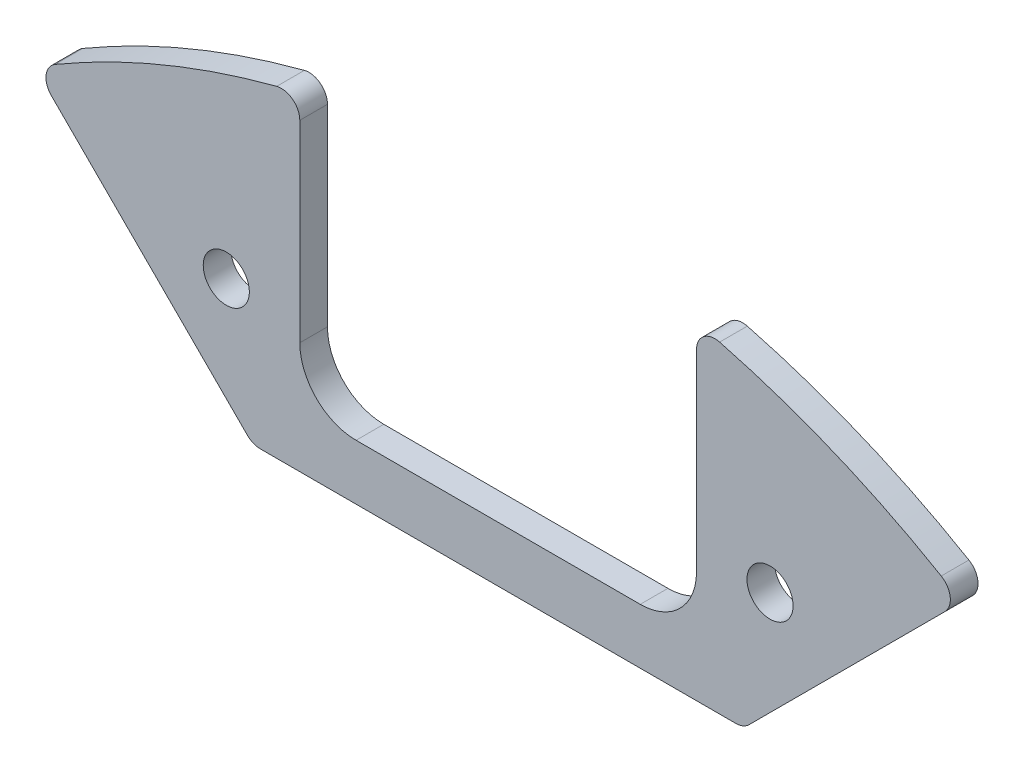
ISO-10303-21;
HEADER;
FILE_DESCRIPTION(('STEP AP214'),'2;1');
FILE_NAME('part.step','',(''),(''),'','','');
FILE_SCHEMA(('AUTOMOTIVE_DESIGN { 1 0 10303 214 1 1 1 1 }'));
ENDSEC;
DATA;
#1=APPLICATION_CONTEXT('core data for automotive mechanical design processes');
#2=APPLICATION_PROTOCOL_DEFINITION('international standard','automotive_design',2000,#1);
#3=PRODUCT_CONTEXT('',#1,'mechanical');
#4=PRODUCT('Part','Part','',(#3));
#5=PRODUCT_RELATED_PRODUCT_CATEGORY('part','',(#4));
#6=PRODUCT_DEFINITION_FORMATION('','',#4);
#7=PRODUCT_DEFINITION_CONTEXT('part definition',#1,'design');
#8=PRODUCT_DEFINITION('design','',#6,#7);
#9=PRODUCT_DEFINITION_SHAPE('','',#8);
#10=(LENGTH_UNIT() NAMED_UNIT(*) SI_UNIT(.MILLI.,.METRE.));
#11=(NAMED_UNIT(*) PLANE_ANGLE_UNIT() SI_UNIT($,.RADIAN.));
#12=(NAMED_UNIT(*) SI_UNIT($,.STERADIAN.) SOLID_ANGLE_UNIT());
#13=UNCERTAINTY_MEASURE_WITH_UNIT(LENGTH_MEASURE(1.E-05),#10,'distance_accuracy_value','');
#14=(GEOMETRIC_REPRESENTATION_CONTEXT(3) GLOBAL_UNCERTAINTY_ASSIGNED_CONTEXT((#13)) GLOBAL_UNIT_ASSIGNED_CONTEXT((#10,
#11,#12)) REPRESENTATION_CONTEXT('',''));
#15=CARTESIAN_POINT('',(0.,0.,0.));
#16=DIRECTION('',(0.,0.,1.));
#17=DIRECTION('',(1.,0.,0.));
#18=AXIS2_PLACEMENT_3D('',#15,#16,#17);
#19=CARTESIAN_POINT('',(0.,0.,1.5));
#20=DIRECTION('',(0.,0.,-1.));
#21=DIRECTION('',(-1.,0.,0.));
#22=AXIS2_PLACEMENT_3D('',#19,#20,#21);
#23=CYLINDRICAL_SURFACE('',#22,47.5);
#24=CARTESIAN_POINT('',(0.,0.,0.));
#25=DIRECTION('',(0.,0.,1.));
#26=DIRECTION('',(1.,0.,0.));
#27=AXIS2_PLACEMENT_3D('',#24,#25,#26);
#28=CIRCLE('',#27,47.5);
#29=CARTESIAN_POINT('',(-12.002688172043,45.9585190867232,0.));
#30=VERTEX_POINT('',#29);
#31=CARTESIAN_POINT('',(-24.0103983005942,40.9847626984325,0.));
#32=VERTEX_POINT('',#31);
#33=EDGE_CURVE('E176',#30,#32,#28,.T.);
#34=ORIENTED_EDGE('',*,*,#33,.T.);
#35=DIRECTION('',(0.,0.,-1.));
#36=VECTOR('',#35,1.);
#37=CARTESIAN_POINT('',(-24.0103983005942,40.9847626984325,1.5));
#38=LINE('',#37,#36);
#39=CARTESIAN_POINT('',(-24.0103983005942,40.9847626984325,1.5));
#40=VERTEX_POINT('',#39);
#41=EDGE_CURVE('E221',#32,#40,#38,.F.);
#42=ORIENTED_EDGE('',*,*,#41,.T.);
#43=CARTESIAN_POINT('',(0.,0.,1.5));
#44=DIRECTION('',(0.,0.,1.));
#45=DIRECTION('',(1.,0.,0.));
#46=AXIS2_PLACEMENT_3D('',#43,#44,#45);
#47=CIRCLE('',#46,47.5);
#48=CARTESIAN_POINT('',(-12.002688172043,45.9585190867232,1.5));
#49=VERTEX_POINT('',#48);
#50=EDGE_CURVE('E179',#49,#40,#47,.T.);
#51=ORIENTED_EDGE('',*,*,#50,.F.);
#52=DIRECTION('',(0.,0.,-1.));
#53=VECTOR('',#52,1.);
#54=CARTESIAN_POINT('',(-12.002688172043,45.9585190867232,1.5));
#55=LINE('',#54,#53);
#56=EDGE_CURVE('E164',#49,#30,#55,.T.);
#57=ORIENTED_EDGE('',*,*,#56,.T.);
#58=EDGE_LOOP('',(#34,#42,#51,#57));
#59=FACE_BOUND('',#58,.T.);
#60=ADVANCED_FACE('F44',(#59),#23,.T.);
#61=CARTESIAN_POINT('',(24.0103983005937,40.9847626984328,1.5));
#62=VERTEX_POINT('',#61);
#63=CARTESIAN_POINT('',(12.002688172043,45.9585190867232,1.5));
#64=VERTEX_POINT('',#63);
#65=EDGE_CURVE('E186',#62,#64,#47,.T.);
#66=ORIENTED_EDGE('',*,*,#65,.F.);
#67=DIRECTION('',(0.,0.,-1.));
#68=VECTOR('',#67,1.);
#69=CARTESIAN_POINT('',(24.0103983005937,40.9847626984328,1.5));
#70=LINE('',#69,#68);
#71=CARTESIAN_POINT('',(24.0103983005937,40.9847626984328,0.));
#72=VERTEX_POINT('',#71);
#73=EDGE_CURVE('E325',#62,#72,#70,.T.);
#74=ORIENTED_EDGE('',*,*,#73,.T.);
#75=CARTESIAN_POINT('',(12.002688172043,45.9585190867232,0.));
#76=VERTEX_POINT('',#75);
#77=EDGE_CURVE('E187',#72,#76,#28,.T.);
#78=ORIENTED_EDGE('',*,*,#77,.T.);
#79=DIRECTION('',(0.,0.,-1.));
#80=VECTOR('',#79,1.);
#81=CARTESIAN_POINT('',(12.002688172043,45.9585190867232,1.5));
#82=LINE('',#81,#80);
#83=EDGE_CURVE('E180',#76,#64,#82,.F.);
#84=ORIENTED_EDGE('',*,*,#83,.T.);
#85=EDGE_LOOP('',(#66,#74,#78,#84));
#86=FACE_BOUND('',#85,.T.);
#87=ADVANCED_FACE('F380',(#86),#23,.T.);
#88=CARTESIAN_POINT('',(0.,0.,1.5));
#89=DIRECTION('',(0.,0.,1.));
#90=DIRECTION('',(1.,0.,0.));
#91=AXIS2_PLACEMENT_3D('',#88,#89,#90);
#92=PLANE('',#91);
#93=DIRECTION('',(1.,0.,0.));
#94=VECTOR('',#93,1.);
#95=CARTESIAN_POINT('',(0.,28.5,1.5));
#96=LINE('',#95,#94);
#97=CARTESIAN_POINT('',(-12.8829906421162,28.5,1.5));
#98=VERTEX_POINT('',#97);
#99=CARTESIAN_POINT('',(12.8829906421156,28.5,1.5));
#100=VERTEX_POINT('',#99);
#101=EDGE_CURVE('E307',#98,#100,#96,.T.);
#102=ORIENTED_EDGE('',*,*,#101,.T.);
#103=CARTESIAN_POINT('',(12.8829906421156,29.5,1.5));
#104=DIRECTION('',(0.,0.,1.));
#105=DIRECTION('',(1.,0.,0.));
#106=AXIS2_PLACEMENT_3D('',#103,#104,#105);
#107=CIRCLE('',#106,1.);
#108=CARTESIAN_POINT('',(13.5900974233022,28.7928932188135,1.5));
#109=VERTEX_POINT('',#108);
#110=EDGE_CURVE('E299',#100,#109,#107,.T.);
#111=ORIENTED_EDGE('',*,*,#110,.T.);
#112=DIRECTION('',(-0.707106781186539,-0.707106781186556,0.));
#113=VECTOR('',#112,1.);
#114=CARTESIAN_POINT('',(14.6724657096205,29.8752615051318,1.5));
#115=LINE('',#114,#113);
#116=CARTESIAN_POINT('',(24.212023012294,39.4148188078056,1.5));
#117=VERTEX_POINT('',#116);
#118=EDGE_CURVE('E280',#117,#109,#115,.T.);
#119=ORIENTED_EDGE('',*,*,#118,.F.);
#120=CARTESIAN_POINT('',(23.5049162311075,40.1219255889921,1.5));
#121=DIRECTION('',(0.,0.,1.));
#122=DIRECTION('',(1.,0.,0.));
#123=AXIS2_PLACEMENT_3D('',#120,#121,#122);
#124=CIRCLE('',#123,1.);
#125=EDGE_CURVE('E226',#117,#62,#124,.T.);
#126=ORIENTED_EDGE('',*,*,#125,.T.);
#127=ORIENTED_EDGE('',*,*,#65,.T.);
#128=CARTESIAN_POINT('',(11.75,44.9909713164764,1.5));
#129=DIRECTION('',(0.,0.,1.));
#130=DIRECTION('',(1.,0.,0.));
#131=AXIS2_PLACEMENT_3D('',#128,#129,#130);
#132=CIRCLE('',#131,1.);
#133=CARTESIAN_POINT('',(10.75,44.9909713164764,1.5));
#134=VERTEX_POINT('',#133);
#135=EDGE_CURVE('E201',#64,#134,#132,.T.);
#136=ORIENTED_EDGE('',*,*,#135,.T.);
#137=DIRECTION('',(0.,1.,0.));
#138=VECTOR('',#137,1.);
#139=CARTESIAN_POINT('',(10.75,43.525,1.5));
#140=LINE('',#139,#138);
#141=CARTESIAN_POINT('',(10.75,34.55,1.5));
#142=VERTEX_POINT('',#141);
#143=EDGE_CURVE('E240',#142,#134,#140,.T.);
#144=ORIENTED_EDGE('',*,*,#143,.F.);
#145=CARTESIAN_POINT('',(7.70000000000001,34.55,1.5));
#146=DIRECTION('',(0.,0.,1.));
#147=DIRECTION('',(1.,0.,0.));
#148=AXIS2_PLACEMENT_3D('',#145,#146,#147);
#149=CIRCLE('',#148,3.05);
#150=CARTESIAN_POINT('',(7.70000000000001,31.5,1.5));
#151=VERTEX_POINT('',#150);
#152=EDGE_CURVE('E358',#142,#151,#149,.F.);
#153=ORIENTED_EDGE('',*,*,#152,.T.);
#154=DIRECTION('',(1.,0.,0.));
#155=VECTOR('',#154,1.);
#156=CARTESIAN_POINT('',(-10.75,31.5,1.5));
#157=LINE('',#156,#155);
#158=CARTESIAN_POINT('',(-7.69999999999999,31.5,1.5));
#159=VERTEX_POINT('',#158);
#160=EDGE_CURVE('E251',#159,#151,#157,.T.);
#161=ORIENTED_EDGE('',*,*,#160,.F.);
#162=CARTESIAN_POINT('',(-7.69999999999999,34.55,1.5));
#163=DIRECTION('',(0.,0.,1.));
#164=DIRECTION('',(1.,0.,0.));
#165=AXIS2_PLACEMENT_3D('',#162,#163,#164);
#166=CIRCLE('',#165,3.05);
#167=CARTESIAN_POINT('',(-10.75,34.55,1.5));
#168=VERTEX_POINT('',#167);
#169=EDGE_CURVE('E350',#159,#168,#166,.F.);
#170=ORIENTED_EDGE('',*,*,#169,.T.);
#171=DIRECTION('',(0.,-1.,0.));
#172=VECTOR('',#171,1.);
#173=CARTESIAN_POINT('',(-10.75,31.5,1.5));
#174=LINE('',#173,#172);
#175=CARTESIAN_POINT('',(-10.75,44.9909713164764,1.5));
#176=VERTEX_POINT('',#175);
#177=EDGE_CURVE('E245',#176,#168,#174,.T.);
#178=ORIENTED_EDGE('',*,*,#177,.F.);
#179=CARTESIAN_POINT('',(-11.75,44.9909713164764,1.5));
#180=DIRECTION('',(0.,0.,1.));
#181=DIRECTION('',(1.,0.,0.));
#182=AXIS2_PLACEMENT_3D('',#179,#180,#181);
#183=CIRCLE('',#182,1.);
#184=EDGE_CURVE('E197',#176,#49,#183,.T.);
#185=ORIENTED_EDGE('',*,*,#184,.T.);
#186=ORIENTED_EDGE('',*,*,#50,.T.);
#187=CARTESIAN_POINT('',(-23.504916231108,40.1219255889918,1.5));
#188=DIRECTION('',(0.,0.,1.));
#189=DIRECTION('',(1.,0.,0.));
#190=AXIS2_PLACEMENT_3D('',#187,#188,#189);
#191=CIRCLE('',#190,1.);
#192=CARTESIAN_POINT('',(-24.2120230122946,39.4148188078052,1.5));
#193=VERTEX_POINT('',#192);
#194=EDGE_CURVE('E214',#40,#193,#191,.T.);
#195=ORIENTED_EDGE('',*,*,#194,.T.);
#196=DIRECTION('',(-0.707106781186549,0.707106781186546,0.));
#197=VECTOR('',#196,1.);
#198=CARTESIAN_POINT('',(-23.1754247533892,38.3782205488998,1.5));
#199=LINE('',#198,#197);
#200=CARTESIAN_POINT('',(-13.5900974233028,28.7928932188135,1.5));
#201=VERTEX_POINT('',#200);
#202=EDGE_CURVE('E275',#201,#193,#199,.T.);
#203=ORIENTED_EDGE('',*,*,#202,.F.);
#204=CARTESIAN_POINT('',(-12.8829906421162,29.5,1.5));
#205=DIRECTION('',(0.,0.,1.));
#206=DIRECTION('',(1.,0.,0.));
#207=AXIS2_PLACEMENT_3D('',#204,#205,#206);
#208=CIRCLE('',#207,1.);
#209=EDGE_CURVE('E294',#201,#98,#208,.T.);
#210=ORIENTED_EDGE('',*,*,#209,.T.);
#211=EDGE_LOOP('',(#102,#111,#119,#126,#127,#136,#144,#153,#161,#170,#178,#185,#186,#195,#203,#210));
#212=FACE_BOUND('',#211,.T.);
#213=CARTESIAN_POINT('',(-14.7333121460563,35.5693620016844,1.5));
#214=DIRECTION('',(0.,0.,1.));
#215=DIRECTION('',(0.707106781186546,0.707106781186549,0.));
#216=AXIS2_PLACEMENT_3D('',#213,#214,#215);
#217=CIRCLE('',#216,1.25);
#218=CARTESIAN_POINT('',(-13.8494286695731,36.4532454781676,1.5));
#219=VERTEX_POINT('',#218);
#220=EDGE_CURVE('E286',#219,#219,#217,.T.);
#221=ORIENTED_EDGE('',*,*,#220,.F.);
#222=EDGE_LOOP('',(#221));
#223=FACE_BOUND('',#222,.T.);
#224=CARTESIAN_POINT('',(14.7333121460557,35.5693620016846,1.5));
#225=DIRECTION('',(0.,0.,1.));
#226=DIRECTION('',(1.,0.,0.));
#227=AXIS2_PLACEMENT_3D('',#224,#225,#226);
#228=CIRCLE('',#227,1.25);
#229=CARTESIAN_POINT('',(15.9833121460557,35.5693620016846,1.5));
#230=VERTEX_POINT('',#229);
#231=EDGE_CURVE('E268',#230,#230,#228,.T.);
#232=ORIENTED_EDGE('',*,*,#231,.F.);
#233=EDGE_LOOP('',(#232));
#234=FACE_BOUND('',#233,.T.);
#235=ADVANCED_FACE('F339',(#212,#223,#234),#92,.T.);
#236=CARTESIAN_POINT('',(0.,0.,0.));
#237=DIRECTION('',(0.,0.,1.));
#238=DIRECTION('',(1.,0.,0.));
#239=AXIS2_PLACEMENT_3D('',#236,#237,#238);
#240=PLANE('',#239);
#241=DIRECTION('',(-0.707106781186539,-0.707106781186556,0.));
#242=VECTOR('',#241,1.);
#243=CARTESIAN_POINT('',(14.6724657096205,29.8752615051318,0.));
#244=LINE('',#243,#242);
#245=CARTESIAN_POINT('',(24.212023012294,39.4148188078056,0.));
#246=VERTEX_POINT('',#245);
#247=CARTESIAN_POINT('',(13.5900974233022,28.7928932188135,0.));
#248=VERTEX_POINT('',#247);
#249=EDGE_CURVE('E279',#246,#248,#244,.T.);
#250=ORIENTED_EDGE('',*,*,#249,.T.);
#251=CARTESIAN_POINT('',(12.8829906421156,29.5,0.));
#252=DIRECTION('',(0.,0.,1.));
#253=DIRECTION('',(1.,0.,0.));
#254=AXIS2_PLACEMENT_3D('',#251,#252,#253);
#255=CIRCLE('',#254,1.);
#256=CARTESIAN_POINT('',(12.8829906421156,28.5,0.));
#257=VERTEX_POINT('',#256);
#258=EDGE_CURVE('E52',#248,#257,#255,.F.);
#259=ORIENTED_EDGE('',*,*,#258,.T.);
#260=DIRECTION('',(1.,0.,0.));
#261=VECTOR('',#260,1.);
#262=CARTESIAN_POINT('',(0.,28.5,0.));
#263=LINE('',#262,#261);
#264=CARTESIAN_POINT('',(-12.8829906421162,28.5,0.));
#265=VERTEX_POINT('',#264);
#266=EDGE_CURVE('E291',#265,#257,#263,.T.);
#267=ORIENTED_EDGE('',*,*,#266,.F.);
#268=CARTESIAN_POINT('',(-12.8829906421162,29.5,0.));
#269=DIRECTION('',(0.,0.,1.));
#270=DIRECTION('',(1.,0.,0.));
#271=AXIS2_PLACEMENT_3D('',#268,#269,#270);
#272=CIRCLE('',#271,1.);
#273=CARTESIAN_POINT('',(-13.5900974233028,28.7928932188135,0.));
#274=VERTEX_POINT('',#273);
#275=EDGE_CURVE('E59',#265,#274,#272,.F.);
#276=ORIENTED_EDGE('',*,*,#275,.T.);
#277=DIRECTION('',(-0.707106781186549,0.707106781186546,0.));
#278=VECTOR('',#277,1.);
#279=CARTESIAN_POINT('',(-23.1754247533892,38.3782205488998,0.));
#280=LINE('',#279,#278);
#281=CARTESIAN_POINT('',(-24.2120230122946,39.4148188078052,0.));
#282=VERTEX_POINT('',#281);
#283=EDGE_CURVE('E273',#274,#282,#280,.T.);
#284=ORIENTED_EDGE('',*,*,#283,.T.);
#285=CARTESIAN_POINT('',(-23.504916231108,40.1219255889918,0.));
#286=DIRECTION('',(0.,0.,1.));
#287=DIRECTION('',(1.,0.,0.));
#288=AXIS2_PLACEMENT_3D('',#285,#286,#287);
#289=CIRCLE('',#288,1.);
#290=EDGE_CURVE('E185',#282,#32,#289,.F.);
#291=ORIENTED_EDGE('',*,*,#290,.T.);
#292=ORIENTED_EDGE('',*,*,#33,.F.);
#293=CARTESIAN_POINT('',(-11.75,44.9909713164764,0.));
#294=DIRECTION('',(0.,0.,1.));
#295=DIRECTION('',(1.,0.,0.));
#296=AXIS2_PLACEMENT_3D('',#293,#294,#295);
#297=CIRCLE('',#296,1.);
#298=CARTESIAN_POINT('',(-10.75,44.9909713164764,0.));
#299=VERTEX_POINT('',#298);
#300=EDGE_CURVE('E160',#30,#299,#297,.F.);
#301=ORIENTED_EDGE('',*,*,#300,.T.);
#302=DIRECTION('',(0.,-1.,0.));
#303=VECTOR('',#302,1.);
#304=CARTESIAN_POINT('',(-10.75,31.5,0.));
#305=LINE('',#304,#303);
#306=CARTESIAN_POINT('',(-10.75,34.55,0.));
#307=VERTEX_POINT('',#306);
#308=EDGE_CURVE('E263',#299,#307,#305,.T.);
#309=ORIENTED_EDGE('',*,*,#308,.T.);
#310=CARTESIAN_POINT('',(-7.69999999999999,34.55,0.));
#311=DIRECTION('',(0.,0.,1.));
#312=DIRECTION('',(1.,0.,0.));
#313=AXIS2_PLACEMENT_3D('',#310,#311,#312);
#314=CIRCLE('',#313,3.05);
#315=CARTESIAN_POINT('',(-7.69999999999999,31.5,0.));
#316=VERTEX_POINT('',#315);
#317=EDGE_CURVE('E349',#307,#316,#314,.T.);
#318=ORIENTED_EDGE('',*,*,#317,.T.);
#319=DIRECTION('',(1.,0.,0.));
#320=VECTOR('',#319,1.);
#321=CARTESIAN_POINT('',(-10.75,31.5,0.));
#322=LINE('',#321,#320);
#323=CARTESIAN_POINT('',(7.70000000000001,31.5,0.));
#324=VERTEX_POINT('',#323);
#325=EDGE_CURVE('E191',#316,#324,#322,.T.);
#326=ORIENTED_EDGE('',*,*,#325,.T.);
#327=CARTESIAN_POINT('',(7.70000000000001,34.55,0.));
#328=DIRECTION('',(0.,0.,1.));
#329=DIRECTION('',(1.,0.,0.));
#330=AXIS2_PLACEMENT_3D('',#327,#328,#329);
#331=CIRCLE('',#330,3.05);
#332=CARTESIAN_POINT('',(10.75,34.55,0.));
#333=VERTEX_POINT('',#332);
#334=EDGE_CURVE('E354',#324,#333,#331,.T.);
#335=ORIENTED_EDGE('',*,*,#334,.T.);
#336=DIRECTION('',(0.,1.,0.));
#337=VECTOR('',#336,1.);
#338=CARTESIAN_POINT('',(10.75,43.525,0.));
#339=LINE('',#338,#337);
#340=CARTESIAN_POINT('',(10.75,44.9909713164764,0.));
#341=VERTEX_POINT('',#340);
#342=EDGE_CURVE('E255',#333,#341,#339,.T.);
#343=ORIENTED_EDGE('',*,*,#342,.T.);
#344=CARTESIAN_POINT('',(11.75,44.9909713164764,0.));
#345=DIRECTION('',(0.,0.,1.));
#346=DIRECTION('',(1.,0.,0.));
#347=AXIS2_PLACEMENT_3D('',#344,#345,#346);
#348=CIRCLE('',#347,1.);
#349=EDGE_CURVE('E169',#341,#76,#348,.F.);
#350=ORIENTED_EDGE('',*,*,#349,.T.);
#351=ORIENTED_EDGE('',*,*,#77,.F.);
#352=CARTESIAN_POINT('',(23.5049162311075,40.1219255889921,0.));
#353=DIRECTION('',(0.,0.,1.));
#354=DIRECTION('',(1.,0.,0.));
#355=AXIS2_PLACEMENT_3D('',#352,#353,#354);
#356=CIRCLE('',#355,1.);
#357=EDGE_CURVE('E230',#72,#246,#356,.F.);
#358=ORIENTED_EDGE('',*,*,#357,.T.);
#359=EDGE_LOOP('',(#250,#259,#267,#276,#284,#291,#292,#301,#309,#318,#326,#335,#343,#350,#351,#358));
#360=FACE_BOUND('',#359,.T.);
#361=CARTESIAN_POINT('',(-14.7333121460563,35.5693620016844,0.));
#362=DIRECTION('',(0.,0.,1.));
#363=DIRECTION('',(0.707106781186546,0.707106781186549,0.));
#364=AXIS2_PLACEMENT_3D('',#361,#362,#363);
#365=CIRCLE('',#364,1.25);
#366=CARTESIAN_POINT('',(-13.8494286695731,36.4532454781676,0.));
#367=VERTEX_POINT('',#366);
#368=EDGE_CURVE('E284',#367,#367,#365,.T.);
#369=ORIENTED_EDGE('',*,*,#368,.T.);
#370=EDGE_LOOP('',(#369));
#371=FACE_BOUND('',#370,.T.);
#372=CARTESIAN_POINT('',(14.7333121460557,35.5693620016846,0.));
#373=DIRECTION('',(0.,0.,1.));
#374=DIRECTION('',(1.,0.,0.));
#375=AXIS2_PLACEMENT_3D('',#372,#373,#374);
#376=CIRCLE('',#375,1.25);
#377=CARTESIAN_POINT('',(15.9833121460557,35.5693620016846,0.));
#378=VERTEX_POINT('',#377);
#379=EDGE_CURVE('E246',#378,#378,#376,.T.);
#380=ORIENTED_EDGE('',*,*,#379,.T.);
#381=EDGE_LOOP('',(#380));
#382=FACE_BOUND('',#381,.T.);
#383=ADVANCED_FACE('F182',(#360,#371,#382),#240,.F.);
#384=CARTESIAN_POINT('',(10.75,43.525,0.));
#385=DIRECTION('',(1.,0.,0.));
#386=DIRECTION('',(0.,1.,0.));
#387=AXIS2_PLACEMENT_3D('',#384,#385,#386);
#388=PLANE('',#387);
#389=ORIENTED_EDGE('',*,*,#143,.T.);
#390=DIRECTION('',(0.,0.,-1.));
#391=VECTOR('',#390,1.);
#392=CARTESIAN_POINT('',(10.75,44.9909713164764,0.));
#393=LINE('',#392,#391);
#394=EDGE_CURVE('E170',#134,#341,#393,.T.);
#395=ORIENTED_EDGE('',*,*,#394,.T.);
#396=ORIENTED_EDGE('',*,*,#342,.F.);
#397=DIRECTION('',(0.,0.,1.));
#398=VECTOR('',#397,1.);
#399=CARTESIAN_POINT('',(10.75,34.55,1.5));
#400=LINE('',#399,#398);
#401=EDGE_CURVE('E366',#333,#142,#400,.T.);
#402=ORIENTED_EDGE('',*,*,#401,.T.);
#403=EDGE_LOOP('',(#389,#395,#396,#402));
#404=FACE_BOUND('',#403,.T.);
#405=ADVANCED_FACE('F377',(#404),#388,.F.);
#406=CARTESIAN_POINT('',(-10.75,43.525,0.));
#407=DIRECTION('',(-1.,0.,0.));
#408=DIRECTION('',(0.,-1.,0.));
#409=AXIS2_PLACEMENT_3D('',#406,#407,#408);
#410=PLANE('',#409);
#411=ORIENTED_EDGE('',*,*,#308,.F.);
#412=DIRECTION('',(0.,0.,-1.));
#413=VECTOR('',#412,1.);
#414=CARTESIAN_POINT('',(-10.75,44.9909713164764,0.));
#415=LINE('',#414,#413);
#416=EDGE_CURVE('E166',#299,#176,#415,.F.);
#417=ORIENTED_EDGE('',*,*,#416,.T.);
#418=ORIENTED_EDGE('',*,*,#177,.T.);
#419=DIRECTION('',(0.,0.,1.));
#420=VECTOR('',#419,1.);
#421=CARTESIAN_POINT('',(-10.75,34.55,0.));
#422=LINE('',#421,#420);
#423=EDGE_CURVE('E360',#168,#307,#422,.F.);
#424=ORIENTED_EDGE('',*,*,#423,.T.);
#425=EDGE_LOOP('',(#411,#417,#418,#424));
#426=FACE_BOUND('',#425,.T.);
#427=ADVANCED_FACE('F429',(#426),#410,.F.);
#428=CARTESIAN_POINT('',(-10.75,31.5,0.));
#429=DIRECTION('',(0.,-1.,0.));
#430=DIRECTION('',(0.,0.,-1.));
#431=AXIS2_PLACEMENT_3D('',#428,#429,#430);
#432=PLANE('',#431);
#433=ORIENTED_EDGE('',*,*,#160,.T.);
#434=DIRECTION('',(0.,0.,1.));
#435=VECTOR('',#434,1.);
#436=CARTESIAN_POINT('',(7.70000000000001,31.5,0.));
#437=LINE('',#436,#435);
#438=EDGE_CURVE('E362',#151,#324,#437,.F.);
#439=ORIENTED_EDGE('',*,*,#438,.T.);
#440=ORIENTED_EDGE('',*,*,#325,.F.);
#441=DIRECTION('',(0.,0.,1.));
#442=VECTOR('',#441,1.);
#443=CARTESIAN_POINT('',(-7.69999999999999,31.5,1.5));
#444=LINE('',#443,#442);
#445=EDGE_CURVE('E364',#316,#159,#444,.T.);
#446=ORIENTED_EDGE('',*,*,#445,.T.);
#447=EDGE_LOOP('',(#433,#439,#440,#446));
#448=FACE_BOUND('',#447,.T.);
#449=ADVANCED_FACE('F425',(#448),#432,.F.);
#450=CARTESIAN_POINT('',(14.7333121460557,35.5693620016846,0.));
#451=DIRECTION('',(0.,0.,1.));
#452=DIRECTION('',(1.,0.,0.));
#453=AXIS2_PLACEMENT_3D('',#450,#451,#452);
#454=CYLINDRICAL_SURFACE('',#453,1.25);
#455=ORIENTED_EDGE('',*,*,#379,.F.);
#456=EDGE_LOOP('',(#455));
#457=FACE_BOUND('',#456,.T.);
#458=ORIENTED_EDGE('',*,*,#231,.T.);
#459=EDGE_LOOP('',(#458));
#460=FACE_BOUND('',#459,.T.);
#461=ADVANCED_FACE('F392',(#457,#460),#454,.F.);
#462=CARTESIAN_POINT('',(11.75,44.9909713164764,1.5));
#463=DIRECTION('',(0.,0.,-1.));
#464=DIRECTION('',(-1.,0.,0.));
#465=AXIS2_PLACEMENT_3D('',#462,#463,#464);
#466=CYLINDRICAL_SURFACE('',#465,1.);
#467=ORIENTED_EDGE('',*,*,#349,.F.);
#468=ORIENTED_EDGE('',*,*,#394,.F.);
#469=ORIENTED_EDGE('',*,*,#135,.F.);
#470=ORIENTED_EDGE('',*,*,#83,.F.);
#471=EDGE_LOOP('',(#467,#468,#469,#470));
#472=FACE_BOUND('',#471,.T.);
#473=ADVANCED_FACE('F379',(#472),#466,.T.);
#474=CARTESIAN_POINT('',(-11.75,44.9909713164764,1.5));
#475=DIRECTION('',(0.,0.,-1.));
#476=DIRECTION('',(-1.,0.,0.));
#477=AXIS2_PLACEMENT_3D('',#474,#475,#476);
#478=CYLINDRICAL_SURFACE('',#477,1.);
#479=ORIENTED_EDGE('',*,*,#184,.F.);
#480=ORIENTED_EDGE('',*,*,#416,.F.);
#481=ORIENTED_EDGE('',*,*,#300,.F.);
#482=ORIENTED_EDGE('',*,*,#56,.F.);
#483=EDGE_LOOP('',(#479,#480,#481,#482));
#484=FACE_BOUND('',#483,.T.);
#485=ADVANCED_FACE('F163',(#484),#478,.T.);
#486=CARTESIAN_POINT('',(7.70000000000001,34.55,0.));
#487=DIRECTION('',(0.,0.,-1.));
#488=DIRECTION('',(-1.,0.,0.));
#489=AXIS2_PLACEMENT_3D('',#486,#487,#488);
#490=CYLINDRICAL_SURFACE('',#489,3.05);
#491=ORIENTED_EDGE('',*,*,#334,.F.);
#492=ORIENTED_EDGE('',*,*,#438,.F.);
#493=ORIENTED_EDGE('',*,*,#152,.F.);
#494=ORIENTED_EDGE('',*,*,#401,.F.);
#495=EDGE_LOOP('',(#491,#492,#493,#494));
#496=FACE_BOUND('',#495,.T.);
#497=ADVANCED_FACE('F395',(#496),#490,.F.);
#498=CARTESIAN_POINT('',(-7.69999999999999,34.55,0.));
#499=DIRECTION('',(0.,0.,-1.));
#500=DIRECTION('',(-1.,0.,0.));
#501=AXIS2_PLACEMENT_3D('',#498,#499,#500);
#502=CYLINDRICAL_SURFACE('',#501,3.05);
#503=ORIENTED_EDGE('',*,*,#317,.F.);
#504=ORIENTED_EDGE('',*,*,#423,.F.);
#505=ORIENTED_EDGE('',*,*,#169,.F.);
#506=ORIENTED_EDGE('',*,*,#445,.F.);
#507=EDGE_LOOP('',(#503,#504,#505,#506));
#508=FACE_BOUND('',#507,.T.);
#509=ADVANCED_FACE('F398',(#508),#502,.F.);
#510=CARTESIAN_POINT('',(-23.1754247533892,38.3782205488998,0.));
#511=DIRECTION('',(0.707106781186546,0.707106781186548,0.));
#512=DIRECTION('',(-0.707106781186549,0.707106781186546,0.));
#513=AXIS2_PLACEMENT_3D('',#510,#511,#512);
#514=PLANE('',#513);
#515=ORIENTED_EDGE('',*,*,#283,.F.);
#516=DIRECTION('',(0.,0.,1.));
#517=VECTOR('',#516,1.);
#518=CARTESIAN_POINT('',(-13.5900974233028,28.7928932188135,1.5));
#519=LINE('',#518,#517);
#520=EDGE_CURVE('E12',#274,#201,#519,.T.);
#521=ORIENTED_EDGE('',*,*,#520,.T.);
#522=ORIENTED_EDGE('',*,*,#202,.T.);
#523=DIRECTION('',(0.,0.,-1.));
#524=VECTOR('',#523,1.);
#525=CARTESIAN_POINT('',(-24.2120230122946,39.4148188078052,0.));
#526=LINE('',#525,#524);
#527=EDGE_CURVE('E220',#193,#282,#526,.T.);
#528=ORIENTED_EDGE('',*,*,#527,.T.);
#529=EDGE_LOOP('',(#515,#521,#522,#528));
#530=FACE_BOUND('',#529,.T.);
#531=ADVANCED_FACE('F345',(#530),#514,.F.);
#532=CARTESIAN_POINT('',(23.1754247533886,38.3782205489001,0.));
#533=DIRECTION('',(-0.707106781186556,0.707106781186539,0.));
#534=DIRECTION('',(-0.707106781186539,-0.707106781186556,0.));
#535=AXIS2_PLACEMENT_3D('',#532,#533,#534);
#536=PLANE('',#535);
#537=ORIENTED_EDGE('',*,*,#118,.T.);
#538=DIRECTION('',(0.,0.,1.));
#539=VECTOR('',#538,1.);
#540=CARTESIAN_POINT('',(13.5900974233022,28.7928932188135,0.));
#541=LINE('',#540,#539);
#542=EDGE_CURVE('E67',#109,#248,#541,.F.);
#543=ORIENTED_EDGE('',*,*,#542,.T.);
#544=ORIENTED_EDGE('',*,*,#249,.F.);
#545=DIRECTION('',(0.,0.,-1.));
#546=VECTOR('',#545,1.);
#547=CARTESIAN_POINT('',(24.212023012294,39.4148188078056,0.));
#548=LINE('',#547,#546);
#549=EDGE_CURVE('E323',#246,#117,#548,.F.);
#550=ORIENTED_EDGE('',*,*,#549,.T.);
#551=EDGE_LOOP('',(#537,#543,#544,#550));
#552=FACE_BOUND('',#551,.T.);
#553=ADVANCED_FACE('F337',(#552),#536,.F.);
#554=CARTESIAN_POINT('',(-14.7333121460563,35.5693620016844,0.));
#555=DIRECTION('',(0.,0.,1.));
#556=DIRECTION('',(1.,0.,0.));
#557=AXIS2_PLACEMENT_3D('',#554,#555,#556);
#558=CYLINDRICAL_SURFACE('',#557,1.25);
#559=ORIENTED_EDGE('',*,*,#368,.F.);
#560=EDGE_LOOP('',(#559));
#561=FACE_BOUND('',#560,.T.);
#562=ORIENTED_EDGE('',*,*,#220,.T.);
#563=EDGE_LOOP('',(#562));
#564=FACE_BOUND('',#563,.T.);
#565=ADVANCED_FACE('F405',(#561,#564),#558,.F.);
#566=CARTESIAN_POINT('',(-23.504916231108,40.1219255889918,1.5));
#567=DIRECTION('',(0.,0.,-1.));
#568=DIRECTION('',(-1.,0.,0.));
#569=AXIS2_PLACEMENT_3D('',#566,#567,#568);
#570=CYLINDRICAL_SURFACE('',#569,1.);
#571=ORIENTED_EDGE('',*,*,#290,.F.);
#572=ORIENTED_EDGE('',*,*,#527,.F.);
#573=ORIENTED_EDGE('',*,*,#194,.F.);
#574=ORIENTED_EDGE('',*,*,#41,.F.);
#575=EDGE_LOOP('',(#571,#572,#573,#574));
#576=FACE_BOUND('',#575,.T.);
#577=ADVANCED_FACE('F348',(#576),#570,.T.);
#578=CARTESIAN_POINT('',(23.5049162311075,40.1219255889921,1.5));
#579=DIRECTION('',(0.,0.,-1.));
#580=DIRECTION('',(-1.,0.,0.));
#581=AXIS2_PLACEMENT_3D('',#578,#579,#580);
#582=CYLINDRICAL_SURFACE('',#581,1.);
#583=ORIENTED_EDGE('',*,*,#125,.F.);
#584=ORIENTED_EDGE('',*,*,#549,.F.);
#585=ORIENTED_EDGE('',*,*,#357,.F.);
#586=ORIENTED_EDGE('',*,*,#73,.F.);
#587=EDGE_LOOP('',(#583,#584,#585,#586));
#588=FACE_BOUND('',#587,.T.);
#589=ADVANCED_FACE('F336',(#588),#582,.T.);
#590=CARTESIAN_POINT('',(0.,28.5,0.));
#591=DIRECTION('',(0.,-1.,0.));
#592=DIRECTION('',(0.,0.,-1.));
#593=AXIS2_PLACEMENT_3D('',#590,#591,#592);
#594=PLANE('',#593);
#595=ORIENTED_EDGE('',*,*,#266,.T.);
#596=DIRECTION('',(0.,0.,1.));
#597=VECTOR('',#596,1.);
#598=CARTESIAN_POINT('',(12.8829906421156,28.5,1.5));
#599=LINE('',#598,#597);
#600=EDGE_CURVE('E300',#257,#100,#599,.T.);
#601=ORIENTED_EDGE('',*,*,#600,.T.);
#602=ORIENTED_EDGE('',*,*,#101,.F.);
#603=DIRECTION('',(0.,0.,1.));
#604=VECTOR('',#603,1.);
#605=CARTESIAN_POINT('',(-12.8829906421162,28.5,0.));
#606=LINE('',#605,#604);
#607=EDGE_CURVE('E319',#98,#265,#606,.F.);
#608=ORIENTED_EDGE('',*,*,#607,.T.);
#609=EDGE_LOOP('',(#595,#601,#602,#608));
#610=FACE_BOUND('',#609,.T.);
#611=ADVANCED_FACE('F316',(#610),#594,.T.);
#612=CARTESIAN_POINT('',(12.8829906421156,29.5,0.));
#613=DIRECTION('',(0.,0.,-1.));
#614=DIRECTION('',(-1.,0.,0.));
#615=AXIS2_PLACEMENT_3D('',#612,#613,#614);
#616=CYLINDRICAL_SURFACE('',#615,1.);
#617=ORIENTED_EDGE('',*,*,#258,.F.);
#618=ORIENTED_EDGE('',*,*,#542,.F.);
#619=ORIENTED_EDGE('',*,*,#110,.F.);
#620=ORIENTED_EDGE('',*,*,#600,.F.);
#621=EDGE_LOOP('',(#617,#618,#619,#620));
#622=FACE_BOUND('',#621,.T.);
#623=ADVANCED_FACE('F322',(#622),#616,.T.);
#624=CARTESIAN_POINT('',(-12.8829906421162,29.5,0.));
#625=DIRECTION('',(0.,0.,-1.));
#626=DIRECTION('',(-1.,0.,0.));
#627=AXIS2_PLACEMENT_3D('',#624,#625,#626);
#628=CYLINDRICAL_SURFACE('',#627,1.);
#629=ORIENTED_EDGE('',*,*,#275,.F.);
#630=ORIENTED_EDGE('',*,*,#607,.F.);
#631=ORIENTED_EDGE('',*,*,#209,.F.);
#632=ORIENTED_EDGE('',*,*,#520,.F.);
#633=EDGE_LOOP('',(#629,#630,#631,#632));
#634=FACE_BOUND('',#633,.T.);
#635=ADVANCED_FACE('F46',(#634),#628,.T.);
#636=CLOSED_SHELL('',(#60,#87,#235,#383,#405,#427,#449,#461,#473,#485,#497,#509,#531,#553,#565,
#577,#589,#611,#623,#635));
#637=MANIFOLD_SOLID_BREP('B2',#636);
#638=ADVANCED_BREP_SHAPE_REPRESENTATION('',(#18,#637),#14);
#639=SHAPE_DEFINITION_REPRESENTATION(#9,#638);
ENDSEC;
END-ISO-10303-21;
